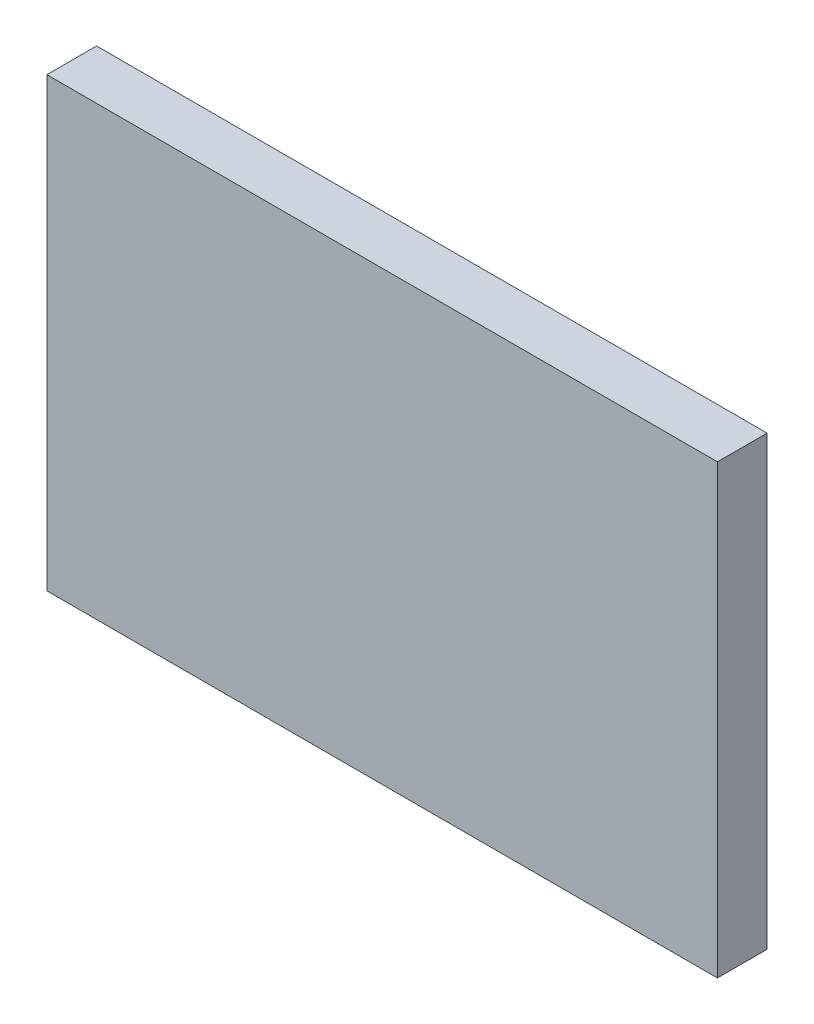
ISO-10303-21;
HEADER;
FILE_DESCRIPTION(('STEP AP214'),'2;1');
FILE_NAME('part.step','',(''),(''),'','','');
FILE_SCHEMA(('AUTOMOTIVE_DESIGN { 1 0 10303 214 1 1 1 1 }'));
ENDSEC;
DATA;
#1=APPLICATION_CONTEXT('core data for automotive mechanical design processes');
#2=APPLICATION_PROTOCOL_DEFINITION('international standard','automotive_design',2000,#1);
#3=PRODUCT_CONTEXT('',#1,'mechanical');
#4=PRODUCT('Part','Part','',(#3));
#5=PRODUCT_RELATED_PRODUCT_CATEGORY('part','',(#4));
#6=PRODUCT_DEFINITION_FORMATION('','',#4);
#7=PRODUCT_DEFINITION_CONTEXT('part definition',#1,'design');
#8=PRODUCT_DEFINITION('design','',#6,#7);
#9=PRODUCT_DEFINITION_SHAPE('','',#8);
#10=(LENGTH_UNIT() NAMED_UNIT(*) SI_UNIT(.MILLI.,.METRE.));
#11=(NAMED_UNIT(*) PLANE_ANGLE_UNIT() SI_UNIT($,.RADIAN.));
#12=(NAMED_UNIT(*) SI_UNIT($,.STERADIAN.) SOLID_ANGLE_UNIT());
#13=UNCERTAINTY_MEASURE_WITH_UNIT(LENGTH_MEASURE(1.E-05),#10,'distance_accuracy_value','');
#14=(GEOMETRIC_REPRESENTATION_CONTEXT(3) GLOBAL_UNCERTAINTY_ASSIGNED_CONTEXT((#13)) GLOBAL_UNIT_ASSIGNED_CONTEXT((#10,
#11,#12)) REPRESENTATION_CONTEXT('',''));
#15=CARTESIAN_POINT('',(0.,0.,0.));
#16=DIRECTION('',(0.,0.,1.));
#17=DIRECTION('',(1.,0.,0.));
#18=AXIS2_PLACEMENT_3D('',#15,#16,#17);
#19=CARTESIAN_POINT('',(1371.6,0.,0.));
#20=DIRECTION('',(0.,0.,-1.));
#21=DIRECTION('',(-1.,0.,0.));
#22=AXIS2_PLACEMENT_3D('',#19,#20,#21);
#23=PLANE('',#22);
#24=DIRECTION('',(0.,-1.,0.));
#25=VECTOR('',#24,1.);
#26=CARTESIAN_POINT('',(0.,0.,0.));
#27=LINE('',#26,#25);
#28=CARTESIAN_POINT('',(0.,914.4,0.));
#29=VERTEX_POINT('',#28);
#30=CARTESIAN_POINT('',(0.,0.,0.));
#31=VERTEX_POINT('',#30);
#32=EDGE_CURVE('E96',#29,#31,#27,.T.);
#33=ORIENTED_EDGE('',*,*,#32,.T.);
#34=DIRECTION('',(-1.,0.,0.));
#35=VECTOR('',#34,1.);
#36=CARTESIAN_POINT('',(1371.6,0.,0.));
#37=LINE('',#36,#35);
#38=CARTESIAN_POINT('',(1371.6,0.,0.));
#39=VERTEX_POINT('',#38);
#40=EDGE_CURVE('E11',#39,#31,#37,.T.);
#41=ORIENTED_EDGE('',*,*,#40,.F.);
#42=DIRECTION('',(0.,-1.,0.));
#43=VECTOR('',#42,1.);
#44=CARTESIAN_POINT('',(1371.6,0.,0.));
#45=LINE('',#44,#43);
#46=CARTESIAN_POINT('',(1371.6,914.4,0.));
#47=VERTEX_POINT('',#46);
#48=EDGE_CURVE('E84',#47,#39,#45,.T.);
#49=ORIENTED_EDGE('',*,*,#48,.F.);
#50=DIRECTION('',(-1.,0.,0.));
#51=VECTOR('',#50,1.);
#52=CARTESIAN_POINT('',(1371.6,914.4,0.));
#53=LINE('',#52,#51);
#54=EDGE_CURVE('E92',#47,#29,#53,.T.);
#55=ORIENTED_EDGE('',*,*,#54,.T.);
#56=EDGE_LOOP('',(#33,#41,#49,#55));
#57=FACE_BOUND('',#56,.T.);
#58=ADVANCED_FACE('F33',(#57),#23,.F.);
#59=CARTESIAN_POINT('',(1371.6,0.,0.));
#60=DIRECTION('',(0.,1.,0.));
#61=DIRECTION('',(0.,0.,1.));
#62=AXIS2_PLACEMENT_3D('',#59,#60,#61);
#63=PLANE('',#62);
#64=DIRECTION('',(0.,0.,-1.));
#65=VECTOR('',#64,1.);
#66=CARTESIAN_POINT('',(0.,0.,0.));
#67=LINE('',#66,#65);
#68=CARTESIAN_POINT('',(0.,0.,-101.6));
#69=VERTEX_POINT('',#68);
#70=EDGE_CURVE('E88',#31,#69,#67,.T.);
#71=ORIENTED_EDGE('',*,*,#70,.T.);
#72=DIRECTION('',(-1.,0.,0.));
#73=VECTOR('',#72,1.);
#74=CARTESIAN_POINT('',(1371.6,0.,-101.6));
#75=LINE('',#74,#73);
#76=CARTESIAN_POINT('',(1371.6,0.,-101.6));
#77=VERTEX_POINT('',#76);
#78=EDGE_CURVE('E41',#77,#69,#75,.T.);
#79=ORIENTED_EDGE('',*,*,#78,.F.);
#80=DIRECTION('',(0.,0.,-1.));
#81=VECTOR('',#80,1.);
#82=CARTESIAN_POINT('',(1371.6,0.,0.));
#83=LINE('',#82,#81);
#84=EDGE_CURVE('E79',#39,#77,#83,.T.);
#85=ORIENTED_EDGE('',*,*,#84,.F.);
#86=ORIENTED_EDGE('',*,*,#40,.T.);
#87=EDGE_LOOP('',(#71,#79,#85,#86));
#88=FACE_BOUND('',#87,.T.);
#89=ADVANCED_FACE('F87',(#88),#63,.F.);
#90=CARTESIAN_POINT('',(1371.6,0.,-101.6));
#91=DIRECTION('',(0.,0.,1.));
#92=DIRECTION('',(1.,0.,0.));
#93=AXIS2_PLACEMENT_3D('',#90,#91,#92);
#94=PLANE('',#93);
#95=DIRECTION('',(0.,1.,0.));
#96=VECTOR('',#95,1.);
#97=CARTESIAN_POINT('',(0.,0.,-101.6));
#98=LINE('',#97,#96);
#99=CARTESIAN_POINT('',(0.,914.4,-101.6));
#100=VERTEX_POINT('',#99);
#101=EDGE_CURVE('E66',#69,#100,#98,.T.);
#102=ORIENTED_EDGE('',*,*,#101,.T.);
#103=DIRECTION('',(-1.,0.,0.));
#104=VECTOR('',#103,1.);
#105=CARTESIAN_POINT('',(1371.6,914.4,-101.6));
#106=LINE('',#105,#104);
#107=CARTESIAN_POINT('',(1371.6,914.4,-101.6));
#108=VERTEX_POINT('',#107);
#109=EDGE_CURVE('E89',#108,#100,#106,.T.);
#110=ORIENTED_EDGE('',*,*,#109,.F.);
#111=DIRECTION('',(0.,1.,0.));
#112=VECTOR('',#111,1.);
#113=CARTESIAN_POINT('',(1371.6,0.,-101.6));
#114=LINE('',#113,#112);
#115=EDGE_CURVE('E82',#77,#108,#114,.T.);
#116=ORIENTED_EDGE('',*,*,#115,.F.);
#117=ORIENTED_EDGE('',*,*,#78,.T.);
#118=EDGE_LOOP('',(#102,#110,#116,#117));
#119=FACE_BOUND('',#118,.T.);
#120=ADVANCED_FACE('F90',(#119),#94,.F.);
#121=CARTESIAN_POINT('',(1371.6,914.4,0.));
#122=DIRECTION('',(0.,-1.,0.));
#123=DIRECTION('',(0.,0.,-1.));
#124=AXIS2_PLACEMENT_3D('',#121,#122,#123);
#125=PLANE('',#124);
#126=DIRECTION('',(0.,0.,1.));
#127=VECTOR('',#126,1.);
#128=CARTESIAN_POINT('',(0.,914.4,0.));
#129=LINE('',#128,#127);
#130=EDGE_CURVE('E72',#100,#29,#129,.T.);
#131=ORIENTED_EDGE('',*,*,#130,.T.);
#132=ORIENTED_EDGE('',*,*,#54,.F.);
#133=DIRECTION('',(0.,0.,1.));
#134=VECTOR('',#133,1.);
#135=CARTESIAN_POINT('',(1371.6,914.4,0.));
#136=LINE('',#135,#134);
#137=EDGE_CURVE('E49',#108,#47,#136,.T.);
#138=ORIENTED_EDGE('',*,*,#137,.F.);
#139=ORIENTED_EDGE('',*,*,#109,.T.);
#140=EDGE_LOOP('',(#131,#132,#138,#139));
#141=FACE_BOUND('',#140,.T.);
#142=ADVANCED_FACE('F103',(#141),#125,.F.);
#143=CARTESIAN_POINT('',(1371.6,0.,0.));
#144=DIRECTION('',(-1.,0.,0.));
#145=DIRECTION('',(0.,0.,1.));
#146=AXIS2_PLACEMENT_3D('',#143,#144,#145);
#147=PLANE('',#146);
#148=ORIENTED_EDGE('',*,*,#48,.T.);
#149=ORIENTED_EDGE('',*,*,#84,.T.);
#150=ORIENTED_EDGE('',*,*,#115,.T.);
#151=ORIENTED_EDGE('',*,*,#137,.T.);
#152=EDGE_LOOP('',(#148,#149,#150,#151));
#153=FACE_BOUND('',#152,.T.);
#154=ADVANCED_FACE('F80',(#153),#147,.F.);
#155=CARTESIAN_POINT('',(0.,0.,0.));
#156=DIRECTION('',(-1.,0.,0.));
#157=DIRECTION('',(0.,0.,1.));
#158=AXIS2_PLACEMENT_3D('',#155,#156,#157);
#159=PLANE('',#158);
#160=ORIENTED_EDGE('',*,*,#32,.F.);
#161=ORIENTED_EDGE('',*,*,#130,.F.);
#162=ORIENTED_EDGE('',*,*,#101,.F.);
#163=ORIENTED_EDGE('',*,*,#70,.F.);
#164=EDGE_LOOP('',(#160,#161,#162,#163));
#165=FACE_BOUND('',#164,.T.);
#166=ADVANCED_FACE('F106',(#165),#159,.T.);
#167=CLOSED_SHELL('',(#58,#89,#120,#142,#154,#166));
#168=MANIFOLD_SOLID_BREP('B2',#167);
#169=ADVANCED_BREP_SHAPE_REPRESENTATION('',(#18,#168),#14);
#170=SHAPE_DEFINITION_REPRESENTATION(#9,#169);
ENDSEC;
END-ISO-10303-21;
